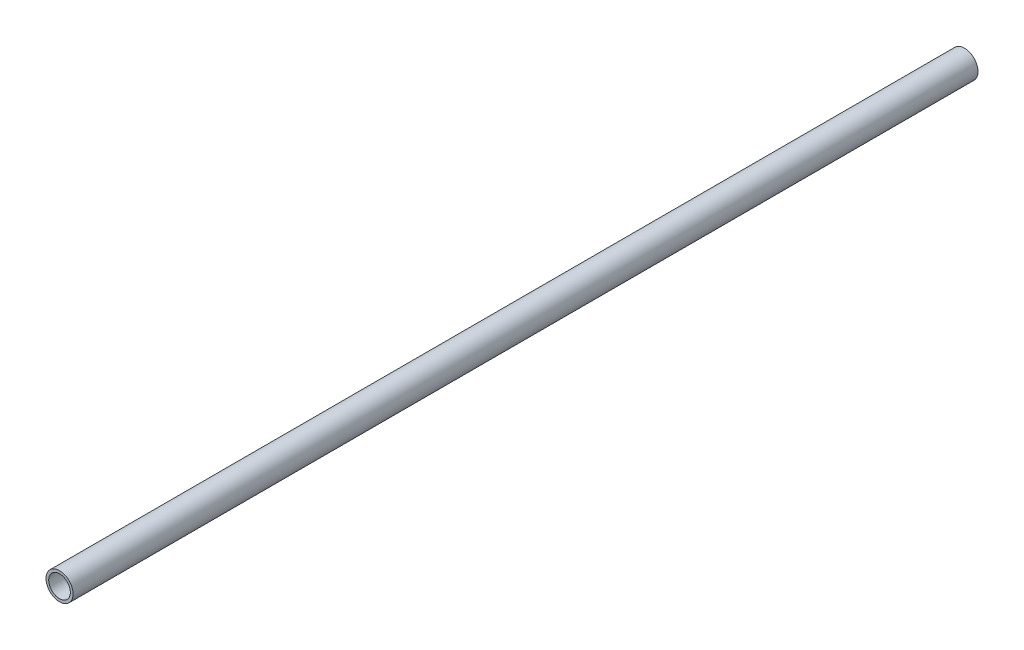
ISO-10303-21;
HEADER;
FILE_DESCRIPTION(('STEP AP214'),'2;1');
FILE_NAME('part.step','',(''),(''),'','','');
FILE_SCHEMA(('AUTOMOTIVE_DESIGN { 1 0 10303 214 1 1 1 1 }'));
ENDSEC;
DATA;
#1=APPLICATION_CONTEXT('core data for automotive mechanical design processes');
#2=APPLICATION_PROTOCOL_DEFINITION('international standard','automotive_design',2000,#1);
#3=PRODUCT_CONTEXT('',#1,'mechanical');
#4=PRODUCT('Part','Part','',(#3));
#5=PRODUCT_RELATED_PRODUCT_CATEGORY('part','',(#4));
#6=PRODUCT_DEFINITION_FORMATION('','',#4);
#7=PRODUCT_DEFINITION_CONTEXT('part definition',#1,'design');
#8=PRODUCT_DEFINITION('design','',#6,#7);
#9=PRODUCT_DEFINITION_SHAPE('','',#8);
#10=(LENGTH_UNIT() NAMED_UNIT(*) SI_UNIT(.MILLI.,.METRE.));
#11=(NAMED_UNIT(*) PLANE_ANGLE_UNIT() SI_UNIT($,.RADIAN.));
#12=(NAMED_UNIT(*) SI_UNIT($,.STERADIAN.) SOLID_ANGLE_UNIT());
#13=UNCERTAINTY_MEASURE_WITH_UNIT(LENGTH_MEASURE(1.E-05),#10,'distance_accuracy_value','');
#14=(GEOMETRIC_REPRESENTATION_CONTEXT(3) GLOBAL_UNCERTAINTY_ASSIGNED_CONTEXT((#13)) GLOBAL_UNIT_ASSIGNED_CONTEXT((#10,
#11,#12)) REPRESENTATION_CONTEXT('',''));
#15=CARTESIAN_POINT('',(0.,0.,0.));
#16=DIRECTION('',(0.,0.,1.));
#17=DIRECTION('',(1.,0.,0.));
#18=AXIS2_PLACEMENT_3D('',#15,#16,#17);
#19=CARTESIAN_POINT('',(16.0000000000002,15.9999999999999,105.254833995939));
#20=DIRECTION('',(0.,0.,-1.));
#21=DIRECTION('',(-1.,0.,0.));
#22=AXIS2_PLACEMENT_3D('',#19,#20,#21);
#23=CYLINDRICAL_SURFACE('',#22,16.);
#24=CARTESIAN_POINT('',(16.0000000000002,15.9999999999999,30.));
#25=DIRECTION('',(0.,0.,-1.));
#26=DIRECTION('',(-1.,0.,0.));
#27=AXIS2_PLACEMENT_3D('',#24,#25,#26);
#28=CIRCLE('',#27,16.);
#29=CARTESIAN_POINT('',(2.32452945780892E-13,15.9999999999999,30.));
#30=VERTEX_POINT('',#29);
#31=EDGE_CURVE('E40',#30,#30,#28,.T.);
#32=ORIENTED_EDGE('',*,*,#31,.T.);
#33=EDGE_LOOP('',(#32));
#34=FACE_BOUND('',#33,.T.);
#35=CARTESIAN_POINT('',(16.0000000000002,15.9999999999999,-1040.));
#36=DIRECTION('',(0.,0.,1.));
#37=DIRECTION('',(1.,0.,0.));
#38=AXIS2_PLACEMENT_3D('',#35,#36,#37);
#39=CIRCLE('',#38,16.);
#40=CARTESIAN_POINT('',(32.0000000000002,15.9999999999999,-1040.));
#41=VERTEX_POINT('',#40);
#42=EDGE_CURVE('E48',#41,#41,#39,.F.);
#43=ORIENTED_EDGE('',*,*,#42,.F.);
#44=EDGE_LOOP('',(#43));
#45=FACE_BOUND('',#44,.T.);
#46=ADVANCED_FACE('F33',(#34,#45),#23,.T.);
#47=CARTESIAN_POINT('',(16.0000000000002,15.9999999999999,105.254833995939));
#48=DIRECTION('',(0.,0.,-1.));
#49=DIRECTION('',(-1.,0.,0.));
#50=AXIS2_PLACEMENT_3D('',#47,#48,#49);
#51=CYLINDRICAL_SURFACE('',#50,12.8);
#52=CARTESIAN_POINT('',(16.0000000000002,15.9999999999999,30.));
#53=DIRECTION('',(0.,0.,-1.));
#54=DIRECTION('',(-1.,0.,0.));
#55=AXIS2_PLACEMENT_3D('',#52,#53,#54);
#56=CIRCLE('',#55,12.8);
#57=CARTESIAN_POINT('',(3.20000000000023,15.9999999999999,30.));
#58=VERTEX_POINT('',#57);
#59=EDGE_CURVE('E10',#58,#58,#56,.T.);
#60=ORIENTED_EDGE('',*,*,#59,.F.);
#61=EDGE_LOOP('',(#60));
#62=FACE_BOUND('',#61,.T.);
#63=CARTESIAN_POINT('',(16.0000000000002,15.9999999999999,-1040.));
#64=DIRECTION('',(0.,0.,1.));
#65=DIRECTION('',(1.,0.,0.));
#66=AXIS2_PLACEMENT_3D('',#63,#64,#65);
#67=CIRCLE('',#66,12.8);
#68=CARTESIAN_POINT('',(28.8000000000002,15.9999999999999,-1040.));
#69=VERTEX_POINT('',#68);
#70=EDGE_CURVE('E44',#69,#69,#67,.F.);
#71=ORIENTED_EDGE('',*,*,#70,.T.);
#72=EDGE_LOOP('',(#71));
#73=FACE_BOUND('',#72,.T.);
#74=ADVANCED_FACE('F58',(#62,#73),#51,.F.);
#75=CARTESIAN_POINT('',(1585.49459788994,-38.5000000000001,29.9999999999998));
#76=DIRECTION('',(0.,0.,-1.));
#77=DIRECTION('',(0.,1.,0.));
#78=AXIS2_PLACEMENT_3D('',#75,#76,#77);
#79=PLANE('',#78);
#80=ORIENTED_EDGE('',*,*,#59,.T.);
#81=EDGE_LOOP('',(#80));
#82=FACE_BOUND('',#81,.T.);
#83=ORIENTED_EDGE('',*,*,#31,.F.);
#84=EDGE_LOOP('',(#83));
#85=FACE_BOUND('',#84,.T.);
#86=ADVANCED_FACE('F35',(#82,#85),#79,.F.);
#87=CARTESIAN_POINT('',(1585.49459788994,-38.5,-1040.));
#88=DIRECTION('',(0.,0.,1.));
#89=DIRECTION('',(0.,-1.,0.));
#90=AXIS2_PLACEMENT_3D('',#87,#88,#89);
#91=PLANE('',#90);
#92=ORIENTED_EDGE('',*,*,#42,.T.);
#93=EDGE_LOOP('',(#92));
#94=FACE_BOUND('',#93,.T.);
#95=ORIENTED_EDGE('',*,*,#70,.F.);
#96=EDGE_LOOP('',(#95));
#97=FACE_BOUND('',#96,.T.);
#98=ADVANCED_FACE('F54',(#94,#97),#91,.F.);
#99=CLOSED_SHELL('',(#46,#74,#86,#98));
#100=MANIFOLD_SOLID_BREP('B2',#99);
#101=ADVANCED_BREP_SHAPE_REPRESENTATION('',(#18,#100),#14);
#102=SHAPE_DEFINITION_REPRESENTATION(#9,#101);
ENDSEC;
END-ISO-10303-21;
